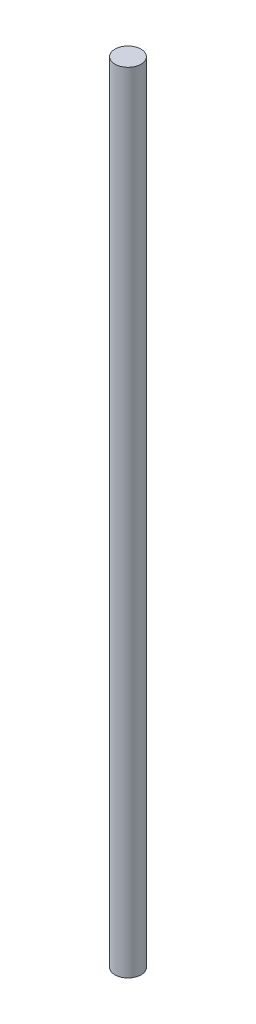
ISO-10303-21;
HEADER;
FILE_DESCRIPTION(('STEP AP214'),'2;1');
FILE_NAME('part.step','',(''),(''),'','','');
FILE_SCHEMA(('AUTOMOTIVE_DESIGN { 1 0 10303 214 1 1 1 1 }'));
ENDSEC;
DATA;
#1=APPLICATION_CONTEXT('core data for automotive mechanical design processes');
#2=APPLICATION_PROTOCOL_DEFINITION('international standard','automotive_design',2000,#1);
#3=PRODUCT_CONTEXT('',#1,'mechanical');
#4=PRODUCT('Part','Part','',(#3));
#5=PRODUCT_RELATED_PRODUCT_CATEGORY('part','',(#4));
#6=PRODUCT_DEFINITION_FORMATION('','',#4);
#7=PRODUCT_DEFINITION_CONTEXT('part definition',#1,'design');
#8=PRODUCT_DEFINITION('design','',#6,#7);
#9=PRODUCT_DEFINITION_SHAPE('','',#8);
#10=(LENGTH_UNIT() NAMED_UNIT(*) SI_UNIT(.MILLI.,.METRE.));
#11=(NAMED_UNIT(*) PLANE_ANGLE_UNIT() SI_UNIT($,.RADIAN.));
#12=(NAMED_UNIT(*) SI_UNIT($,.STERADIAN.) SOLID_ANGLE_UNIT());
#13=UNCERTAINTY_MEASURE_WITH_UNIT(LENGTH_MEASURE(1.E-05),#10,'distance_accuracy_value','');
#14=(GEOMETRIC_REPRESENTATION_CONTEXT(3) GLOBAL_UNCERTAINTY_ASSIGNED_CONTEXT((#13)) GLOBAL_UNIT_ASSIGNED_CONTEXT((#10,
#11,#12)) REPRESENTATION_CONTEXT('',''));
#15=CARTESIAN_POINT('',(0.,0.,0.));
#16=DIRECTION('',(0.,0.,1.));
#17=DIRECTION('',(1.,0.,0.));
#18=AXIS2_PLACEMENT_3D('',#15,#16,#17);
#19=CARTESIAN_POINT('',(0.,60.5,0.));
#20=DIRECTION('',(0.,-1.,0.));
#21=DIRECTION('',(0.,0.,-1.));
#22=AXIS2_PLACEMENT_3D('',#19,#20,#21);
#23=CYLINDRICAL_SURFACE('',#22,2.);
#24=CARTESIAN_POINT('',(0.,60.5,0.));
#25=DIRECTION('',(0.,1.,0.));
#26=DIRECTION('',(0.,0.,1.));
#27=AXIS2_PLACEMENT_3D('',#24,#25,#26);
#28=CIRCLE('',#27,2.);
#29=CARTESIAN_POINT('',(0.,60.5,2.));
#30=VERTEX_POINT('',#29);
#31=EDGE_CURVE('E10',#30,#30,#28,.T.);
#32=ORIENTED_EDGE('',*,*,#31,.F.);
#33=EDGE_LOOP('',(#32));
#34=FACE_BOUND('',#33,.T.);
#35=CARTESIAN_POINT('',(0.,-60.5,0.));
#36=DIRECTION('',(0.,1.,0.));
#37=DIRECTION('',(0.,0.,1.));
#38=AXIS2_PLACEMENT_3D('',#35,#36,#37);
#39=CIRCLE('',#38,2.);
#40=CARTESIAN_POINT('',(0.,-60.5,2.));
#41=VERTEX_POINT('',#40);
#42=EDGE_CURVE('E33',#41,#41,#39,.T.);
#43=ORIENTED_EDGE('',*,*,#42,.T.);
#44=EDGE_LOOP('',(#43));
#45=FACE_BOUND('',#44,.T.);
#46=ADVANCED_FACE('F30',(#34,#45),#23,.T.);
#47=CARTESIAN_POINT('',(0.,60.5,0.));
#48=DIRECTION('',(0.,1.,0.));
#49=DIRECTION('',(0.,0.,1.));
#50=AXIS2_PLACEMENT_3D('',#47,#48,#49);
#51=PLANE('',#50);
#52=ORIENTED_EDGE('',*,*,#31,.T.);
#53=EDGE_LOOP('',(#52));
#54=FACE_BOUND('',#53,.T.);
#55=ADVANCED_FACE('F45',(#54),#51,.T.);
#56=CARTESIAN_POINT('',(0.,-60.5,0.));
#57=DIRECTION('',(0.,1.,0.));
#58=DIRECTION('',(0.,0.,1.));
#59=AXIS2_PLACEMENT_3D('',#56,#57,#58);
#60=PLANE('',#59);
#61=ORIENTED_EDGE('',*,*,#42,.F.);
#62=EDGE_LOOP('',(#61));
#63=FACE_BOUND('',#62,.T.);
#64=ADVANCED_FACE('F43',(#63),#60,.F.);
#65=CLOSED_SHELL('',(#46,#55,#64));
#66=MANIFOLD_SOLID_BREP('B2',#65);
#67=ADVANCED_BREP_SHAPE_REPRESENTATION('',(#18,#66),#14);
#68=SHAPE_DEFINITION_REPRESENTATION(#9,#67);
ENDSEC;
END-ISO-10303-21;
